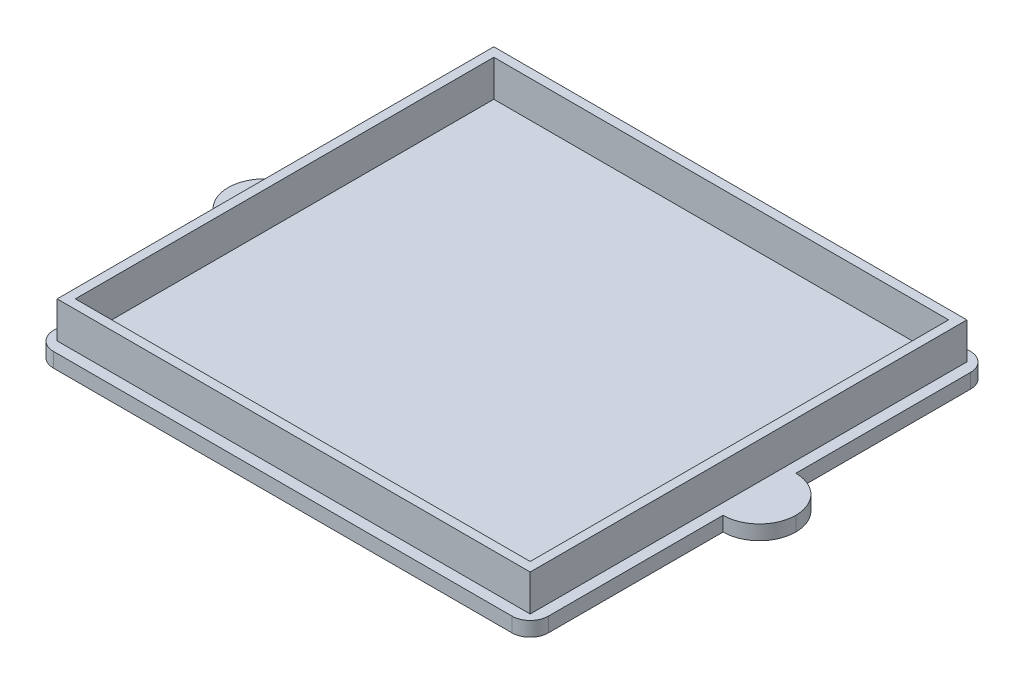
ISO-10303-21;
HEADER;
FILE_DESCRIPTION(('STEP AP214'),'2;1');
FILE_NAME('part.step','',(''),(''),'','','');
FILE_SCHEMA(('AUTOMOTIVE_DESIGN { 1 0 10303 214 1 1 1 1 }'));
ENDSEC;
DATA;
#1=APPLICATION_CONTEXT('core data for automotive mechanical design processes');
#2=APPLICATION_PROTOCOL_DEFINITION('international standard','automotive_design',2000,#1);
#3=PRODUCT_CONTEXT('',#1,'mechanical');
#4=PRODUCT('Part','Part','',(#3));
#5=PRODUCT_RELATED_PRODUCT_CATEGORY('part','',(#4));
#6=PRODUCT_DEFINITION_FORMATION('','',#4);
#7=PRODUCT_DEFINITION_CONTEXT('part definition',#1,'design');
#8=PRODUCT_DEFINITION('design','',#6,#7);
#9=PRODUCT_DEFINITION_SHAPE('','',#8);
#10=(LENGTH_UNIT() NAMED_UNIT(*) SI_UNIT(.MILLI.,.METRE.));
#11=(NAMED_UNIT(*) PLANE_ANGLE_UNIT() SI_UNIT($,.RADIAN.));
#12=(NAMED_UNIT(*) SI_UNIT($,.STERADIAN.) SOLID_ANGLE_UNIT());
#13=UNCERTAINTY_MEASURE_WITH_UNIT(LENGTH_MEASURE(1.E-05),#10,'distance_accuracy_value','');
#14=(GEOMETRIC_REPRESENTATION_CONTEXT(3) GLOBAL_UNCERTAINTY_ASSIGNED_CONTEXT((#13)) GLOBAL_UNIT_ASSIGNED_CONTEXT((#10,
#11,#12)) REPRESENTATION_CONTEXT('',''));
#15=CARTESIAN_POINT('',(0.,0.,0.));
#16=DIRECTION('',(0.,0.,1.));
#17=DIRECTION('',(1.,0.,0.));
#18=AXIS2_PLACEMENT_3D('',#15,#16,#17);
#19=CARTESIAN_POINT('',(0.,4.,0.));
#20=DIRECTION('',(0.,1.,0.));
#21=DIRECTION('',(0.,0.,1.));
#22=AXIS2_PLACEMENT_3D('',#19,#20,#21);
#23=PLANE('',#22);
#24=CARTESIAN_POINT('',(68.,4.,0.));
#25=DIRECTION('',(0.,1.,0.));
#26=DIRECTION('',(0.,0.,1.));
#27=AXIS2_PLACEMENT_3D('',#24,#25,#26);
#28=CIRCLE('',#27,10.);
#29=CARTESIAN_POINT('',(68.,4.,9.99999999999999));
#30=VERTEX_POINT('',#29);
#31=CARTESIAN_POINT('',(78.,4.,0.));
#32=VERTEX_POINT('',#31);
#33=EDGE_CURVE('E42',#30,#32,#28,.T.);
#34=ORIENTED_EDGE('',*,*,#33,.T.);
#35=CARTESIAN_POINT('',(68.,4.,0.));
#36=DIRECTION('',(0.,1.,0.));
#37=DIRECTION('',(0.,0.,1.));
#38=AXIS2_PLACEMENT_3D('',#35,#36,#37);
#39=CIRCLE('',#38,10.);
#40=CARTESIAN_POINT('',(68.,4.,-10.));
#41=VERTEX_POINT('',#40);
#42=EDGE_CURVE('E11',#32,#41,#39,.T.);
#43=ORIENTED_EDGE('',*,*,#42,.T.);
#44=DIRECTION('',(0.,0.,-1.));
#45=VECTOR('',#44,1.);
#46=CARTESIAN_POINT('',(68.,4.,-10.));
#47=LINE('',#46,#45);
#48=CARTESIAN_POINT('',(68.,4.,-58.));
#49=VERTEX_POINT('',#48);
#50=EDGE_CURVE('E256',#41,#49,#47,.T.);
#51=ORIENTED_EDGE('',*,*,#50,.T.);
#52=CARTESIAN_POINT('',(63.,4.,-58.));
#53=DIRECTION('',(0.,1.,0.));
#54=DIRECTION('',(0.,0.,1.));
#55=AXIS2_PLACEMENT_3D('',#52,#53,#54);
#56=CIRCLE('',#55,5.);
#57=CARTESIAN_POINT('',(63.,4.,-63.));
#58=VERTEX_POINT('',#57);
#59=EDGE_CURVE('E319',#49,#58,#56,.T.);
#60=ORIENTED_EDGE('',*,*,#59,.T.);
#61=DIRECTION('',(-1.,0.,0.));
#62=VECTOR('',#61,1.);
#63=CARTESIAN_POINT('',(-68.,4.,-63.));
#64=LINE('',#63,#62);
#65=CARTESIAN_POINT('',(-62.9999999999999,4.,-63.));
#66=VERTEX_POINT('',#65);
#67=EDGE_CURVE('E260',#58,#66,#64,.T.);
#68=ORIENTED_EDGE('',*,*,#67,.T.);
#69=CARTESIAN_POINT('',(-62.9999999999999,4.,-58.));
#70=DIRECTION('',(0.,1.,0.));
#71=DIRECTION('',(0.,0.,1.));
#72=AXIS2_PLACEMENT_3D('',#69,#70,#71);
#73=CIRCLE('',#72,5.);
#74=CARTESIAN_POINT('',(-68.,4.,-58.));
#75=VERTEX_POINT('',#74);
#76=EDGE_CURVE('E321',#66,#75,#73,.T.);
#77=ORIENTED_EDGE('',*,*,#76,.T.);
#78=DIRECTION('',(0.,0.,1.));
#79=VECTOR('',#78,1.);
#80=CARTESIAN_POINT('',(-68.,4.,-63.));
#81=LINE('',#80,#79);
#82=CARTESIAN_POINT('',(-68.,4.,-10.));
#83=VERTEX_POINT('',#82);
#84=EDGE_CURVE('E263',#75,#83,#81,.T.);
#85=ORIENTED_EDGE('',*,*,#84,.T.);
#86=CARTESIAN_POINT('',(-68.,4.,0.));
#87=DIRECTION('',(0.,1.,0.));
#88=DIRECTION('',(0.,0.,1.));
#89=AXIS2_PLACEMENT_3D('',#86,#87,#88);
#90=CIRCLE('',#89,10.);
#91=CARTESIAN_POINT('',(-78.,4.,0.));
#92=VERTEX_POINT('',#91);
#93=EDGE_CURVE('E55',#83,#92,#90,.T.);
#94=ORIENTED_EDGE('',*,*,#93,.T.);
#95=CARTESIAN_POINT('',(-68.,4.,0.));
#96=DIRECTION('',(0.,1.,0.));
#97=DIRECTION('',(0.,0.,1.));
#98=AXIS2_PLACEMENT_3D('',#95,#96,#97);
#99=CIRCLE('',#98,10.);
#100=CARTESIAN_POINT('',(-68.,4.,9.99999999999999));
#101=VERTEX_POINT('',#100);
#102=EDGE_CURVE('E344',#92,#101,#99,.T.);
#103=ORIENTED_EDGE('',*,*,#102,.T.);
#104=DIRECTION('',(0.,0.,1.));
#105=VECTOR('',#104,1.);
#106=CARTESIAN_POINT('',(-68.,4.,9.99999999999999));
#107=LINE('',#106,#105);
#108=CARTESIAN_POINT('',(-68.,4.,58.));
#109=VERTEX_POINT('',#108);
#110=EDGE_CURVE('E265',#101,#109,#107,.T.);
#111=ORIENTED_EDGE('',*,*,#110,.T.);
#112=CARTESIAN_POINT('',(-63.,4.,58.));
#113=DIRECTION('',(0.,1.,0.));
#114=DIRECTION('',(0.,0.,1.));
#115=AXIS2_PLACEMENT_3D('',#112,#113,#114);
#116=CIRCLE('',#115,5.);
#117=CARTESIAN_POINT('',(-63.,4.,63.));
#118=VERTEX_POINT('',#117);
#119=EDGE_CURVE('E315',#109,#118,#116,.T.);
#120=ORIENTED_EDGE('',*,*,#119,.T.);
#121=DIRECTION('',(1.,0.,0.));
#122=VECTOR('',#121,1.);
#123=CARTESIAN_POINT('',(-68.,4.,63.));
#124=LINE('',#123,#122);
#125=CARTESIAN_POINT('',(63.,4.,63.0000000000001));
#126=VERTEX_POINT('',#125);
#127=EDGE_CURVE('E268',#118,#126,#124,.T.);
#128=ORIENTED_EDGE('',*,*,#127,.T.);
#129=CARTESIAN_POINT('',(63.,4.,58.0000000000001));
#130=DIRECTION('',(0.,1.,0.));
#131=DIRECTION('',(0.,0.,1.));
#132=AXIS2_PLACEMENT_3D('',#129,#130,#131);
#133=CIRCLE('',#132,5.);
#134=CARTESIAN_POINT('',(68.,4.,58.0000000000001));
#135=VERTEX_POINT('',#134);
#136=EDGE_CURVE('E317',#126,#135,#133,.T.);
#137=ORIENTED_EDGE('',*,*,#136,.T.);
#138=DIRECTION('',(0.,0.,-1.));
#139=VECTOR('',#138,1.);
#140=CARTESIAN_POINT('',(68.,4.,9.99999999999999));
#141=LINE('',#140,#139);
#142=EDGE_CURVE('E254',#135,#30,#141,.T.);
#143=ORIENTED_EDGE('',*,*,#142,.T.);
#144=EDGE_LOOP('',(#34,#43,#51,#60,#68,#77,#85,#94,#103,#111,#120,#128,#137,#143));
#145=FACE_BOUND('',#144,.T.);
#146=DIRECTION('',(-1.,0.,0.));
#147=VECTOR('',#146,1.);
#148=CARTESIAN_POINT('',(-65.,4.,-60.));
#149=LINE('',#148,#147);
#150=CARTESIAN_POINT('',(64.9999999999999,4.,-60.));
#151=VERTEX_POINT('',#150);
#152=CARTESIAN_POINT('',(-65.,4.,-60.));
#153=VERTEX_POINT('',#152);
#154=EDGE_CURVE('E238',#151,#153,#149,.T.);
#155=ORIENTED_EDGE('',*,*,#154,.F.);
#156=DIRECTION('',(0.,0.,-1.));
#157=VECTOR('',#156,1.);
#158=CARTESIAN_POINT('',(64.9999999999999,4.,-60.));
#159=LINE('',#158,#157);
#160=CARTESIAN_POINT('',(64.9999999999999,4.,60.));
#161=VERTEX_POINT('',#160);
#162=EDGE_CURVE('E201',#161,#151,#159,.T.);
#163=ORIENTED_EDGE('',*,*,#162,.F.);
#164=DIRECTION('',(1.,0.,0.));
#165=VECTOR('',#164,1.);
#166=CARTESIAN_POINT('',(-65.,4.,60.));
#167=LINE('',#166,#165);
#168=CARTESIAN_POINT('',(-65.,4.,60.));
#169=VERTEX_POINT('',#168);
#170=EDGE_CURVE('E229',#169,#161,#167,.T.);
#171=ORIENTED_EDGE('',*,*,#170,.F.);
#172=DIRECTION('',(0.,0.,1.));
#173=VECTOR('',#172,1.);
#174=CARTESIAN_POINT('',(-65.,4.,-60.));
#175=LINE('',#174,#173);
#176=EDGE_CURVE('E240',#153,#169,#175,.T.);
#177=ORIENTED_EDGE('',*,*,#176,.F.);
#178=EDGE_LOOP('',(#155,#163,#171,#177));
#179=FACE_BOUND('',#178,.T.);
#180=ADVANCED_FACE('F33',(#145,#179),#23,.T.);
#181=CARTESIAN_POINT('',(68.,4.,9.99999999999999));
#182=DIRECTION('',(-1.,0.,0.));
#183=DIRECTION('',(0.,0.,1.));
#184=AXIS2_PLACEMENT_3D('',#181,#182,#183);
#185=PLANE('',#184);
#186=ORIENTED_EDGE('',*,*,#142,.F.);
#187=DIRECTION('',(0.,-1.,0.));
#188=VECTOR('',#187,1.);
#189=CARTESIAN_POINT('',(68.,4.,58.0000000000001));
#190=LINE('',#189,#188);
#191=CARTESIAN_POINT('',(68.,0.,58.0000000000001));
#192=VERTEX_POINT('',#191);
#193=EDGE_CURVE('E325',#135,#192,#190,.T.);
#194=ORIENTED_EDGE('',*,*,#193,.T.);
#195=DIRECTION('',(0.,0.,-1.));
#196=VECTOR('',#195,1.);
#197=CARTESIAN_POINT('',(68.,0.,9.99999999999999));
#198=LINE('',#197,#196);
#199=CARTESIAN_POINT('',(68.,0.,9.99999999999999));
#200=VERTEX_POINT('',#199);
#201=EDGE_CURVE('E253',#192,#200,#198,.T.);
#202=ORIENTED_EDGE('',*,*,#201,.T.);
#203=DIRECTION('',(0.,-1.,0.));
#204=VECTOR('',#203,1.);
#205=CARTESIAN_POINT('',(68.,4.,9.99999999999999));
#206=LINE('',#205,#204);
#207=EDGE_CURVE('E296',#30,#200,#206,.T.);
#208=ORIENTED_EDGE('',*,*,#207,.F.);
#209=EDGE_LOOP('',(#186,#194,#202,#208));
#210=FACE_BOUND('',#209,.T.);
#211=ADVANCED_FACE('F391',(#210),#185,.F.);
#212=CARTESIAN_POINT('',(68.,4.,-63.));
#213=DIRECTION('',(-1.,0.,0.));
#214=DIRECTION('',(0.,0.,1.));
#215=AXIS2_PLACEMENT_3D('',#212,#213,#214);
#216=PLANE('',#215);
#217=DIRECTION('',(0.,0.,-1.));
#218=VECTOR('',#217,1.);
#219=CARTESIAN_POINT('',(68.,0.,-63.));
#220=LINE('',#219,#218);
#221=CARTESIAN_POINT('',(68.,0.,-10.));
#222=VERTEX_POINT('',#221);
#223=CARTESIAN_POINT('',(68.,0.,-58.));
#224=VERTEX_POINT('',#223);
#225=EDGE_CURVE('E274',#222,#224,#220,.T.);
#226=ORIENTED_EDGE('',*,*,#225,.T.);
#227=DIRECTION('',(0.,-1.,0.));
#228=VECTOR('',#227,1.);
#229=CARTESIAN_POINT('',(68.,4.,-58.));
#230=LINE('',#229,#228);
#231=EDGE_CURVE('E323',#224,#49,#230,.F.);
#232=ORIENTED_EDGE('',*,*,#231,.T.);
#233=ORIENTED_EDGE('',*,*,#50,.F.);
#234=DIRECTION('',(0.,-1.,0.));
#235=VECTOR('',#234,1.);
#236=CARTESIAN_POINT('',(68.,4.,-10.));
#237=LINE('',#236,#235);
#238=EDGE_CURVE('E293',#41,#222,#237,.T.);
#239=ORIENTED_EDGE('',*,*,#238,.T.);
#240=EDGE_LOOP('',(#226,#232,#233,#239));
#241=FACE_BOUND('',#240,.T.);
#242=ADVANCED_FACE('F380',(#241),#216,.F.);
#243=CARTESIAN_POINT('',(-68.,4.,-63.));
#244=DIRECTION('',(0.,0.,1.));
#245=DIRECTION('',(1.,0.,0.));
#246=AXIS2_PLACEMENT_3D('',#243,#244,#245);
#247=PLANE('',#246);
#248=DIRECTION('',(-1.,0.,0.));
#249=VECTOR('',#248,1.);
#250=CARTESIAN_POINT('',(-68.,0.,-63.));
#251=LINE('',#250,#249);
#252=CARTESIAN_POINT('',(63.,0.,-63.));
#253=VERTEX_POINT('',#252);
#254=CARTESIAN_POINT('',(-62.9999999999999,0.,-63.));
#255=VERTEX_POINT('',#254);
#256=EDGE_CURVE('E277',#253,#255,#251,.T.);
#257=ORIENTED_EDGE('',*,*,#256,.T.);
#258=DIRECTION('',(0.,-1.,0.));
#259=VECTOR('',#258,1.);
#260=CARTESIAN_POINT('',(-62.9999999999999,4.,-63.));
#261=LINE('',#260,#259);
#262=EDGE_CURVE('E313',#255,#66,#261,.F.);
#263=ORIENTED_EDGE('',*,*,#262,.T.);
#264=ORIENTED_EDGE('',*,*,#67,.F.);
#265=DIRECTION('',(0.,-1.,0.));
#266=VECTOR('',#265,1.);
#267=CARTESIAN_POINT('',(63.,4.,-63.));
#268=LINE('',#267,#266);
#269=EDGE_CURVE('E310',#58,#253,#268,.T.);
#270=ORIENTED_EDGE('',*,*,#269,.T.);
#271=EDGE_LOOP('',(#257,#263,#264,#270));
#272=FACE_BOUND('',#271,.T.);
#273=ADVANCED_FACE('F372',(#272),#247,.F.);
#274=CARTESIAN_POINT('',(-68.,4.,-10.));
#275=DIRECTION('',(1.,0.,0.));
#276=DIRECTION('',(0.,0.,-1.));
#277=AXIS2_PLACEMENT_3D('',#274,#275,#276);
#278=PLANE('',#277);
#279=ORIENTED_EDGE('',*,*,#84,.F.);
#280=DIRECTION('',(0.,-1.,0.));
#281=VECTOR('',#280,1.);
#282=CARTESIAN_POINT('',(-67.9999999999999,4.,-58.));
#283=LINE('',#282,#281);
#284=CARTESIAN_POINT('',(-67.9999999999999,0.,-58.));
#285=VERTEX_POINT('',#284);
#286=EDGE_CURVE('E299',#75,#285,#283,.T.);
#287=ORIENTED_EDGE('',*,*,#286,.T.);
#288=DIRECTION('',(0.,0.,1.));
#289=VECTOR('',#288,1.);
#290=CARTESIAN_POINT('',(-68.,0.,-10.));
#291=LINE('',#290,#289);
#292=CARTESIAN_POINT('',(-68.,0.,-10.));
#293=VERTEX_POINT('',#292);
#294=EDGE_CURVE('E280',#285,#293,#291,.T.);
#295=ORIENTED_EDGE('',*,*,#294,.T.);
#296=DIRECTION('',(0.,-1.,0.));
#297=VECTOR('',#296,1.);
#298=CARTESIAN_POINT('',(-68.,4.,-10.));
#299=LINE('',#298,#297);
#300=EDGE_CURVE('E290',#83,#293,#299,.T.);
#301=ORIENTED_EDGE('',*,*,#300,.F.);
#302=EDGE_LOOP('',(#279,#287,#295,#301));
#303=FACE_BOUND('',#302,.T.);
#304=ADVANCED_FACE('F364',(#303),#278,.F.);
#305=CARTESIAN_POINT('',(-68.,4.,9.99999999999999));
#306=DIRECTION('',(1.,0.,0.));
#307=DIRECTION('',(0.,0.,-1.));
#308=AXIS2_PLACEMENT_3D('',#305,#306,#307);
#309=PLANE('',#308);
#310=DIRECTION('',(0.,0.,1.));
#311=VECTOR('',#310,1.);
#312=CARTESIAN_POINT('',(-68.,0.,9.99999999999999));
#313=LINE('',#312,#311);
#314=CARTESIAN_POINT('',(-68.,0.,9.99999999999999));
#315=VERTEX_POINT('',#314);
#316=CARTESIAN_POINT('',(-68.,0.,58.));
#317=VERTEX_POINT('',#316);
#318=EDGE_CURVE('E283',#315,#317,#313,.T.);
#319=ORIENTED_EDGE('',*,*,#318,.T.);
#320=DIRECTION('',(0.,-1.,0.));
#321=VECTOR('',#320,1.);
#322=CARTESIAN_POINT('',(-68.,4.,58.));
#323=LINE('',#322,#321);
#324=EDGE_CURVE('E333',#317,#109,#323,.F.);
#325=ORIENTED_EDGE('',*,*,#324,.T.);
#326=ORIENTED_EDGE('',*,*,#110,.F.);
#327=DIRECTION('',(0.,-1.,0.));
#328=VECTOR('',#327,1.);
#329=CARTESIAN_POINT('',(-68.,4.,9.99999999999999));
#330=LINE('',#329,#328);
#331=EDGE_CURVE('E271',#101,#315,#330,.T.);
#332=ORIENTED_EDGE('',*,*,#331,.T.);
#333=EDGE_LOOP('',(#319,#325,#326,#332));
#334=FACE_BOUND('',#333,.T.);
#335=ADVANCED_FACE('F408',(#334),#309,.F.);
#336=CARTESIAN_POINT('',(-68.,4.,63.));
#337=DIRECTION('',(0.,0.,-1.));
#338=DIRECTION('',(-1.,0.,0.));
#339=AXIS2_PLACEMENT_3D('',#336,#337,#338);
#340=PLANE('',#339);
#341=DIRECTION('',(1.,0.,0.));
#342=VECTOR('',#341,1.);
#343=CARTESIAN_POINT('',(-68.,0.,63.));
#344=LINE('',#343,#342);
#345=CARTESIAN_POINT('',(-63.,0.,63.));
#346=VERTEX_POINT('',#345);
#347=CARTESIAN_POINT('',(63.,0.,63.0000000000001));
#348=VERTEX_POINT('',#347);
#349=EDGE_CURVE('E257',#346,#348,#344,.T.);
#350=ORIENTED_EDGE('',*,*,#349,.T.);
#351=DIRECTION('',(0.,-1.,0.));
#352=VECTOR('',#351,1.);
#353=CARTESIAN_POINT('',(63.,4.,63.0000000000001));
#354=LINE('',#353,#352);
#355=EDGE_CURVE('E331',#348,#126,#354,.F.);
#356=ORIENTED_EDGE('',*,*,#355,.T.);
#357=ORIENTED_EDGE('',*,*,#127,.F.);
#358=DIRECTION('',(0.,-1.,0.));
#359=VECTOR('',#358,1.);
#360=CARTESIAN_POINT('',(-63.,4.,63.));
#361=LINE('',#360,#359);
#362=EDGE_CURVE('E328',#118,#346,#361,.T.);
#363=ORIENTED_EDGE('',*,*,#362,.T.);
#364=EDGE_LOOP('',(#350,#356,#357,#363));
#365=FACE_BOUND('',#364,.T.);
#366=ADVANCED_FACE('F397',(#365),#340,.F.);
#367=CARTESIAN_POINT('',(0.,0.,0.));
#368=DIRECTION('',(0.,1.,0.));
#369=DIRECTION('',(0.,0.,1.));
#370=AXIS2_PLACEMENT_3D('',#367,#368,#369);
#371=PLANE('',#370);
#372=ORIENTED_EDGE('',*,*,#225,.F.);
#373=CARTESIAN_POINT('',(68.,0.,0.));
#374=DIRECTION('',(0.,1.,0.));
#375=DIRECTION('',(0.,0.,1.));
#376=AXIS2_PLACEMENT_3D('',#373,#374,#375);
#377=CIRCLE('',#376,10.);
#378=CARTESIAN_POINT('',(78.,0.,0.));
#379=VERTEX_POINT('',#378);
#380=EDGE_CURVE('E341',#222,#379,#377,.F.);
#381=ORIENTED_EDGE('',*,*,#380,.T.);
#382=CARTESIAN_POINT('',(68.,0.,0.));
#383=DIRECTION('',(0.,1.,0.));
#384=DIRECTION('',(0.,0.,1.));
#385=AXIS2_PLACEMENT_3D('',#382,#383,#384);
#386=CIRCLE('',#385,10.);
#387=EDGE_CURVE('E339',#379,#200,#386,.F.);
#388=ORIENTED_EDGE('',*,*,#387,.T.);
#389=ORIENTED_EDGE('',*,*,#201,.F.);
#390=CARTESIAN_POINT('',(63.,0.,58.0000000000001));
#391=DIRECTION('',(0.,1.,0.));
#392=DIRECTION('',(0.,0.,1.));
#393=AXIS2_PLACEMENT_3D('',#390,#391,#392);
#394=CIRCLE('',#393,5.);
#395=EDGE_CURVE('E304',#192,#348,#394,.F.);
#396=ORIENTED_EDGE('',*,*,#395,.T.);
#397=ORIENTED_EDGE('',*,*,#349,.F.);
#398=CARTESIAN_POINT('',(-63.,0.,58.));
#399=DIRECTION('',(0.,1.,0.));
#400=DIRECTION('',(0.,0.,1.));
#401=AXIS2_PLACEMENT_3D('',#398,#399,#400);
#402=CIRCLE('',#401,5.);
#403=EDGE_CURVE('E302',#346,#317,#402,.F.);
#404=ORIENTED_EDGE('',*,*,#403,.T.);
#405=ORIENTED_EDGE('',*,*,#318,.F.);
#406=CARTESIAN_POINT('',(-68.,0.,0.));
#407=DIRECTION('',(0.,1.,0.));
#408=DIRECTION('',(0.,0.,1.));
#409=AXIS2_PLACEMENT_3D('',#406,#407,#408);
#410=CIRCLE('',#409,10.);
#411=CARTESIAN_POINT('',(-78.,0.,0.));
#412=VERTEX_POINT('',#411);
#413=EDGE_CURVE('E337',#315,#412,#410,.F.);
#414=ORIENTED_EDGE('',*,*,#413,.T.);
#415=CARTESIAN_POINT('',(-68.,0.,0.));
#416=DIRECTION('',(0.,1.,0.));
#417=DIRECTION('',(0.,0.,1.));
#418=AXIS2_PLACEMENT_3D('',#415,#416,#417);
#419=CIRCLE('',#418,10.);
#420=EDGE_CURVE('E335',#412,#293,#419,.F.);
#421=ORIENTED_EDGE('',*,*,#420,.T.);
#422=ORIENTED_EDGE('',*,*,#294,.F.);
#423=CARTESIAN_POINT('',(-62.9999999999999,0.,-58.));
#424=DIRECTION('',(0.,1.,0.));
#425=DIRECTION('',(0.,0.,1.));
#426=AXIS2_PLACEMENT_3D('',#423,#424,#425);
#427=CIRCLE('',#426,5.);
#428=EDGE_CURVE('E308',#285,#255,#427,.F.);
#429=ORIENTED_EDGE('',*,*,#428,.T.);
#430=ORIENTED_EDGE('',*,*,#256,.F.);
#431=CARTESIAN_POINT('',(63.,0.,-58.));
#432=DIRECTION('',(0.,1.,0.));
#433=DIRECTION('',(0.,0.,1.));
#434=AXIS2_PLACEMENT_3D('',#431,#432,#433);
#435=CIRCLE('',#434,5.);
#436=EDGE_CURVE('E306',#253,#224,#435,.F.);
#437=ORIENTED_EDGE('',*,*,#436,.T.);
#438=EDGE_LOOP('',(#372,#381,#388,#389,#396,#397,#404,#405,#414,#421,#422,#429,#430,#437));
#439=FACE_BOUND('',#438,.T.);
#440=ADVANCED_FACE('F360',(#439),#371,.F.);
#441=CARTESIAN_POINT('',(0.,14.,0.));
#442=DIRECTION('',(0.,1.,0.));
#443=DIRECTION('',(0.,0.,1.));
#444=AXIS2_PLACEMENT_3D('',#441,#442,#443);
#445=PLANE('',#444);
#446=DIRECTION('',(0.,0.,-1.));
#447=VECTOR('',#446,1.);
#448=CARTESIAN_POINT('',(64.9999999999999,14.,-60.));
#449=LINE('',#448,#447);
#450=CARTESIAN_POINT('',(64.9999999999999,14.,60.));
#451=VERTEX_POINT('',#450);
#452=CARTESIAN_POINT('',(64.9999999999999,14.,-60.));
#453=VERTEX_POINT('',#452);
#454=EDGE_CURVE('E225',#451,#453,#449,.T.);
#455=ORIENTED_EDGE('',*,*,#454,.T.);
#456=DIRECTION('',(-1.,0.,0.));
#457=VECTOR('',#456,1.);
#458=CARTESIAN_POINT('',(-65.,14.,-60.));
#459=LINE('',#458,#457);
#460=CARTESIAN_POINT('',(-65.,14.,-60.));
#461=VERTEX_POINT('',#460);
#462=EDGE_CURVE('E228',#453,#461,#459,.T.);
#463=ORIENTED_EDGE('',*,*,#462,.T.);
#464=DIRECTION('',(0.,0.,1.));
#465=VECTOR('',#464,1.);
#466=CARTESIAN_POINT('',(-65.,14.,-60.));
#467=LINE('',#466,#465);
#468=CARTESIAN_POINT('',(-65.,14.,60.));
#469=VERTEX_POINT('',#468);
#470=EDGE_CURVE('E231',#461,#469,#467,.T.);
#471=ORIENTED_EDGE('',*,*,#470,.T.);
#472=DIRECTION('',(1.,0.,0.));
#473=VECTOR('',#472,1.);
#474=CARTESIAN_POINT('',(-65.,14.,60.));
#475=LINE('',#474,#473);
#476=EDGE_CURVE('E233',#469,#451,#475,.T.);
#477=ORIENTED_EDGE('',*,*,#476,.T.);
#478=EDGE_LOOP('',(#455,#463,#471,#477));
#479=FACE_BOUND('',#478,.T.);
#480=DIRECTION('',(-1.,0.,0.));
#481=VECTOR('',#480,1.);
#482=CARTESIAN_POINT('',(-62.5,14.,-57.5));
#483=LINE('',#482,#481);
#484=CARTESIAN_POINT('',(62.5,14.,-57.5));
#485=VERTEX_POINT('',#484);
#486=CARTESIAN_POINT('',(-62.5,14.,-57.5));
#487=VERTEX_POINT('',#486);
#488=EDGE_CURVE('E192',#485,#487,#483,.T.);
#489=ORIENTED_EDGE('',*,*,#488,.F.);
#490=DIRECTION('',(0.,0.,-1.));
#491=VECTOR('',#490,1.);
#492=CARTESIAN_POINT('',(62.5,14.,-57.5));
#493=LINE('',#492,#491);
#494=CARTESIAN_POINT('',(62.5,14.,57.5));
#495=VERTEX_POINT('',#494);
#496=EDGE_CURVE('E182',#495,#485,#493,.T.);
#497=ORIENTED_EDGE('',*,*,#496,.F.);
#498=DIRECTION('',(1.,0.,0.));
#499=VECTOR('',#498,1.);
#500=CARTESIAN_POINT('',(-62.5,14.,57.5));
#501=LINE('',#500,#499);
#502=CARTESIAN_POINT('',(-62.5,14.,57.5));
#503=VERTEX_POINT('',#502);
#504=EDGE_CURVE('E209',#503,#495,#501,.T.);
#505=ORIENTED_EDGE('',*,*,#504,.F.);
#506=DIRECTION('',(0.,0.,1.));
#507=VECTOR('',#506,1.);
#508=CARTESIAN_POINT('',(-62.5,14.,-57.5));
#509=LINE('',#508,#507);
#510=EDGE_CURVE('E207',#487,#503,#509,.T.);
#511=ORIENTED_EDGE('',*,*,#510,.F.);
#512=EDGE_LOOP('',(#489,#497,#505,#511));
#513=FACE_BOUND('',#512,.T.);
#514=ADVANCED_FACE('F205',(#479,#513),#445,.T.);
#515=CARTESIAN_POINT('',(64.9999999999999,14.,-60.));
#516=DIRECTION('',(-1.,0.,0.));
#517=DIRECTION('',(0.,0.,1.));
#518=AXIS2_PLACEMENT_3D('',#515,#516,#517);
#519=PLANE('',#518);
#520=ORIENTED_EDGE('',*,*,#162,.T.);
#521=DIRECTION('',(0.,-1.,0.));
#522=VECTOR('',#521,1.);
#523=CARTESIAN_POINT('',(64.9999999999999,14.,-60.));
#524=LINE('',#523,#522);
#525=EDGE_CURVE('E251',#453,#151,#524,.T.);
#526=ORIENTED_EDGE('',*,*,#525,.F.);
#527=ORIENTED_EDGE('',*,*,#454,.F.);
#528=DIRECTION('',(0.,-1.,0.));
#529=VECTOR('',#528,1.);
#530=CARTESIAN_POINT('',(64.9999999999999,14.,60.));
#531=LINE('',#530,#529);
#532=EDGE_CURVE('E235',#451,#161,#531,.T.);
#533=ORIENTED_EDGE('',*,*,#532,.T.);
#534=EDGE_LOOP('',(#520,#526,#527,#533));
#535=FACE_BOUND('',#534,.T.);
#536=ADVANCED_FACE('F453',(#535),#519,.F.);
#537=CARTESIAN_POINT('',(-65.,14.,-60.));
#538=DIRECTION('',(0.,0.,1.));
#539=DIRECTION('',(1.,0.,0.));
#540=AXIS2_PLACEMENT_3D('',#537,#538,#539);
#541=PLANE('',#540);
#542=ORIENTED_EDGE('',*,*,#154,.T.);
#543=DIRECTION('',(0.,-1.,0.));
#544=VECTOR('',#543,1.);
#545=CARTESIAN_POINT('',(-65.,14.,-60.));
#546=LINE('',#545,#544);
#547=EDGE_CURVE('E248',#461,#153,#546,.T.);
#548=ORIENTED_EDGE('',*,*,#547,.F.);
#549=ORIENTED_EDGE('',*,*,#462,.F.);
#550=ORIENTED_EDGE('',*,*,#525,.T.);
#551=EDGE_LOOP('',(#542,#548,#549,#550));
#552=FACE_BOUND('',#551,.T.);
#553=ADVANCED_FACE('F461',(#552),#541,.F.);
#554=CARTESIAN_POINT('',(-65.,14.,-60.));
#555=DIRECTION('',(1.,0.,0.));
#556=DIRECTION('',(0.,0.,-1.));
#557=AXIS2_PLACEMENT_3D('',#554,#555,#556);
#558=PLANE('',#557);
#559=ORIENTED_EDGE('',*,*,#176,.T.);
#560=DIRECTION('',(0.,-1.,0.));
#561=VECTOR('',#560,1.);
#562=CARTESIAN_POINT('',(-65.,14.,60.));
#563=LINE('',#562,#561);
#564=EDGE_CURVE('E246',#469,#169,#563,.T.);
#565=ORIENTED_EDGE('',*,*,#564,.F.);
#566=ORIENTED_EDGE('',*,*,#470,.F.);
#567=ORIENTED_EDGE('',*,*,#547,.T.);
#568=EDGE_LOOP('',(#559,#565,#566,#567));
#569=FACE_BOUND('',#568,.T.);
#570=ADVANCED_FACE('F457',(#569),#558,.F.);
#571=CARTESIAN_POINT('',(-65.,14.,60.));
#572=DIRECTION('',(0.,0.,-1.));
#573=DIRECTION('',(-1.,0.,0.));
#574=AXIS2_PLACEMENT_3D('',#571,#572,#573);
#575=PLANE('',#574);
#576=ORIENTED_EDGE('',*,*,#170,.T.);
#577=ORIENTED_EDGE('',*,*,#532,.F.);
#578=ORIENTED_EDGE('',*,*,#476,.F.);
#579=ORIENTED_EDGE('',*,*,#564,.T.);
#580=EDGE_LOOP('',(#576,#577,#578,#579));
#581=FACE_BOUND('',#580,.T.);
#582=ADVANCED_FACE('F450',(#581),#575,.F.);
#583=CARTESIAN_POINT('',(62.5,14.,-57.5));
#584=DIRECTION('',(-1.,0.,0.));
#585=DIRECTION('',(0.,0.,1.));
#586=AXIS2_PLACEMENT_3D('',#583,#584,#585);
#587=PLANE('',#586);
#588=DIRECTION('',(0.,0.,-1.));
#589=VECTOR('',#588,1.);
#590=CARTESIAN_POINT('',(62.5,4.,-57.5));
#591=LINE('',#590,#589);
#592=CARTESIAN_POINT('',(62.5,4.,57.5));
#593=VERTEX_POINT('',#592);
#594=CARTESIAN_POINT('',(62.5,4.,-57.5));
#595=VERTEX_POINT('',#594);
#596=EDGE_CURVE('E213',#593,#595,#591,.T.);
#597=ORIENTED_EDGE('',*,*,#596,.F.);
#598=DIRECTION('',(0.,-1.,0.));
#599=VECTOR('',#598,1.);
#600=CARTESIAN_POINT('',(62.5,14.,57.5));
#601=LINE('',#600,#599);
#602=EDGE_CURVE('E188',#495,#593,#601,.T.);
#603=ORIENTED_EDGE('',*,*,#602,.F.);
#604=ORIENTED_EDGE('',*,*,#496,.T.);
#605=DIRECTION('',(0.,-1.,0.));
#606=VECTOR('',#605,1.);
#607=CARTESIAN_POINT('',(62.5,14.,-57.5));
#608=LINE('',#607,#606);
#609=EDGE_CURVE('E186',#485,#595,#608,.T.);
#610=ORIENTED_EDGE('',*,*,#609,.T.);
#611=EDGE_LOOP('',(#597,#603,#604,#610));
#612=FACE_BOUND('',#611,.T.);
#613=ADVANCED_FACE('F185',(#612),#587,.T.);
#614=CARTESIAN_POINT('',(-62.5,14.,-57.5));
#615=DIRECTION('',(0.,0.,1.));
#616=DIRECTION('',(1.,0.,0.));
#617=AXIS2_PLACEMENT_3D('',#614,#615,#616);
#618=PLANE('',#617);
#619=DIRECTION('',(-1.,0.,0.));
#620=VECTOR('',#619,1.);
#621=CARTESIAN_POINT('',(-62.5,4.,-57.5));
#622=LINE('',#621,#620);
#623=CARTESIAN_POINT('',(-62.5,4.,-57.5));
#624=VERTEX_POINT('',#623);
#625=EDGE_CURVE('E200',#595,#624,#622,.T.);
#626=ORIENTED_EDGE('',*,*,#625,.F.);
#627=ORIENTED_EDGE('',*,*,#609,.F.);
#628=ORIENTED_EDGE('',*,*,#488,.T.);
#629=DIRECTION('',(0.,-1.,0.));
#630=VECTOR('',#629,1.);
#631=CARTESIAN_POINT('',(-62.5,14.,-57.5));
#632=LINE('',#631,#630);
#633=EDGE_CURVE('E202',#487,#624,#632,.T.);
#634=ORIENTED_EDGE('',*,*,#633,.T.);
#635=EDGE_LOOP('',(#626,#627,#628,#634));
#636=FACE_BOUND('',#635,.T.);
#637=ADVANCED_FACE('F197',(#636),#618,.T.);
#638=CARTESIAN_POINT('',(-62.5,14.,-57.5));
#639=DIRECTION('',(1.,0.,0.));
#640=DIRECTION('',(0.,0.,-1.));
#641=AXIS2_PLACEMENT_3D('',#638,#639,#640);
#642=PLANE('',#641);
#643=DIRECTION('',(0.,0.,1.));
#644=VECTOR('',#643,1.);
#645=CARTESIAN_POINT('',(-62.5,4.,-57.5));
#646=LINE('',#645,#644);
#647=CARTESIAN_POINT('',(-62.5,4.,57.5));
#648=VERTEX_POINT('',#647);
#649=EDGE_CURVE('E217',#624,#648,#646,.T.);
#650=ORIENTED_EDGE('',*,*,#649,.F.);
#651=ORIENTED_EDGE('',*,*,#633,.F.);
#652=ORIENTED_EDGE('',*,*,#510,.T.);
#653=DIRECTION('',(0.,-1.,0.));
#654=VECTOR('',#653,1.);
#655=CARTESIAN_POINT('',(-62.5,14.,57.5));
#656=LINE('',#655,#654);
#657=EDGE_CURVE('E221',#503,#648,#656,.T.);
#658=ORIENTED_EDGE('',*,*,#657,.T.);
#659=EDGE_LOOP('',(#650,#651,#652,#658));
#660=FACE_BOUND('',#659,.T.);
#661=ADVANCED_FACE('F435',(#660),#642,.T.);
#662=CARTESIAN_POINT('',(-62.5,14.,57.5));
#663=DIRECTION('',(0.,0.,-1.));
#664=DIRECTION('',(-1.,0.,0.));
#665=AXIS2_PLACEMENT_3D('',#662,#663,#664);
#666=PLANE('',#665);
#667=DIRECTION('',(1.,0.,0.));
#668=VECTOR('',#667,1.);
#669=CARTESIAN_POINT('',(-62.5,4.,57.5));
#670=LINE('',#669,#668);
#671=EDGE_CURVE('E193',#648,#593,#670,.T.);
#672=ORIENTED_EDGE('',*,*,#671,.F.);
#673=ORIENTED_EDGE('',*,*,#657,.F.);
#674=ORIENTED_EDGE('',*,*,#504,.T.);
#675=ORIENTED_EDGE('',*,*,#602,.T.);
#676=EDGE_LOOP('',(#672,#673,#674,#675));
#677=FACE_BOUND('',#676,.T.);
#678=ADVANCED_FACE('F428',(#677),#666,.T.);
#679=ORIENTED_EDGE('',*,*,#596,.T.);
#680=ORIENTED_EDGE('',*,*,#625,.T.);
#681=ORIENTED_EDGE('',*,*,#649,.T.);
#682=ORIENTED_EDGE('',*,*,#671,.T.);
#683=EDGE_LOOP('',(#679,#680,#681,#682));
#684=FACE_BOUND('',#683,.T.);
#685=ADVANCED_FACE('F420',(#684),#23,.T.);
#686=CARTESIAN_POINT('',(-62.9999999999999,4.,-58.));
#687=DIRECTION('',(0.,-1.,0.));
#688=DIRECTION('',(0.,0.,-1.));
#689=AXIS2_PLACEMENT_3D('',#686,#687,#688);
#690=CYLINDRICAL_SURFACE('',#689,5.);
#691=ORIENTED_EDGE('',*,*,#76,.F.);
#692=ORIENTED_EDGE('',*,*,#262,.F.);
#693=ORIENTED_EDGE('',*,*,#428,.F.);
#694=ORIENTED_EDGE('',*,*,#286,.F.);
#695=EDGE_LOOP('',(#691,#692,#693,#694));
#696=FACE_BOUND('',#695,.T.);
#697=ADVANCED_FACE('F368',(#696),#690,.T.);
#698=CARTESIAN_POINT('',(63.,4.,-58.));
#699=DIRECTION('',(0.,-1.,0.));
#700=DIRECTION('',(0.,0.,-1.));
#701=AXIS2_PLACEMENT_3D('',#698,#699,#700);
#702=CYLINDRICAL_SURFACE('',#701,5.);
#703=ORIENTED_EDGE('',*,*,#59,.F.);
#704=ORIENTED_EDGE('',*,*,#231,.F.);
#705=ORIENTED_EDGE('',*,*,#436,.F.);
#706=ORIENTED_EDGE('',*,*,#269,.F.);
#707=EDGE_LOOP('',(#703,#704,#705,#706));
#708=FACE_BOUND('',#707,.T.);
#709=ADVANCED_FACE('F377',(#708),#702,.T.);
#710=CARTESIAN_POINT('',(63.,4.,58.0000000000001));
#711=DIRECTION('',(0.,-1.,0.));
#712=DIRECTION('',(0.,0.,-1.));
#713=AXIS2_PLACEMENT_3D('',#710,#711,#712);
#714=CYLINDRICAL_SURFACE('',#713,5.);
#715=ORIENTED_EDGE('',*,*,#136,.F.);
#716=ORIENTED_EDGE('',*,*,#355,.F.);
#717=ORIENTED_EDGE('',*,*,#395,.F.);
#718=ORIENTED_EDGE('',*,*,#193,.F.);
#719=EDGE_LOOP('',(#715,#716,#717,#718));
#720=FACE_BOUND('',#719,.T.);
#721=ADVANCED_FACE('F401',(#720),#714,.T.);
#722=CARTESIAN_POINT('',(-63.,4.,58.));
#723=DIRECTION('',(0.,-1.,0.));
#724=DIRECTION('',(0.,0.,-1.));
#725=AXIS2_PLACEMENT_3D('',#722,#723,#724);
#726=CYLINDRICAL_SURFACE('',#725,5.);
#727=ORIENTED_EDGE('',*,*,#119,.F.);
#728=ORIENTED_EDGE('',*,*,#324,.F.);
#729=ORIENTED_EDGE('',*,*,#403,.F.);
#730=ORIENTED_EDGE('',*,*,#362,.F.);
#731=EDGE_LOOP('',(#727,#728,#729,#730));
#732=FACE_BOUND('',#731,.T.);
#733=ADVANCED_FACE('F405',(#732),#726,.T.);
#734=CARTESIAN_POINT('',(68.,4.,0.));
#735=DIRECTION('',(0.,-1.,0.));
#736=DIRECTION('',(0.,0.,-1.));
#737=AXIS2_PLACEMENT_3D('',#734,#735,#736);
#738=CYLINDRICAL_SURFACE('',#737,10.);
#739=DIRECTION('',(0.,-1.,0.));
#740=VECTOR('',#739,1.);
#741=CARTESIAN_POINT('',(78.,4.,0.));
#742=LINE('',#741,#740);
#743=EDGE_CURVE('E215',#32,#379,#742,.T.);
#744=ORIENTED_EDGE('',*,*,#743,.F.);
#745=ORIENTED_EDGE('',*,*,#33,.F.);
#746=ORIENTED_EDGE('',*,*,#207,.T.);
#747=ORIENTED_EDGE('',*,*,#387,.F.);
#748=EDGE_LOOP('',(#744,#745,#746,#747));
#749=FACE_BOUND('',#748,.T.);
#750=ADVANCED_FACE('F387',(#749),#738,.T.);
#751=CARTESIAN_POINT('',(68.,4.,0.));
#752=DIRECTION('',(0.,-1.,0.));
#753=DIRECTION('',(0.,0.,-1.));
#754=AXIS2_PLACEMENT_3D('',#751,#752,#753);
#755=CYLINDRICAL_SURFACE('',#754,10.);
#756=ORIENTED_EDGE('',*,*,#42,.F.);
#757=ORIENTED_EDGE('',*,*,#743,.T.);
#758=ORIENTED_EDGE('',*,*,#380,.F.);
#759=ORIENTED_EDGE('',*,*,#238,.F.);
#760=EDGE_LOOP('',(#756,#757,#758,#759));
#761=FACE_BOUND('',#760,.T.);
#762=ADVANCED_FACE('F383',(#761),#755,.T.);
#763=CARTESIAN_POINT('',(-68.,4.,0.));
#764=DIRECTION('',(0.,-1.,0.));
#765=DIRECTION('',(0.,0.,-1.));
#766=AXIS2_PLACEMENT_3D('',#763,#764,#765);
#767=CYLINDRICAL_SURFACE('',#766,10.);
#768=DIRECTION('',(0.,-1.,0.));
#769=VECTOR('',#768,1.);
#770=CARTESIAN_POINT('',(-78.,4.,0.));
#771=LINE('',#770,#769);
#772=EDGE_CURVE('E37',#92,#412,#771,.T.);
#773=ORIENTED_EDGE('',*,*,#772,.F.);
#774=ORIENTED_EDGE('',*,*,#93,.F.);
#775=ORIENTED_EDGE('',*,*,#300,.T.);
#776=ORIENTED_EDGE('',*,*,#420,.F.);
#777=EDGE_LOOP('',(#773,#774,#775,#776));
#778=FACE_BOUND('',#777,.T.);
#779=ADVANCED_FACE('F35',(#778),#767,.T.);
#780=CARTESIAN_POINT('',(-68.,4.,0.));
#781=DIRECTION('',(0.,-1.,0.));
#782=DIRECTION('',(0.,0.,-1.));
#783=AXIS2_PLACEMENT_3D('',#780,#781,#782);
#784=CYLINDRICAL_SURFACE('',#783,10.);
#785=ORIENTED_EDGE('',*,*,#102,.F.);
#786=ORIENTED_EDGE('',*,*,#772,.T.);
#787=ORIENTED_EDGE('',*,*,#413,.F.);
#788=ORIENTED_EDGE('',*,*,#331,.F.);
#789=EDGE_LOOP('',(#785,#786,#787,#788));
#790=FACE_BOUND('',#789,.T.);
#791=ADVANCED_FACE('F352',(#790),#784,.T.);
#792=CLOSED_SHELL('',(#180,#211,#242,#273,#304,#335,#366,#440,#514,#536,#553,#570,#582,#613,
#637,#661,#678,#685,#697,#709,#721,#733,#750,#762,#779,#791));
#793=MANIFOLD_SOLID_BREP('B2',#792);
#794=ADVANCED_BREP_SHAPE_REPRESENTATION('',(#18,#793),#14);
#795=SHAPE_DEFINITION_REPRESENTATION(#9,#794);
ENDSEC;
END-ISO-10303-21;
